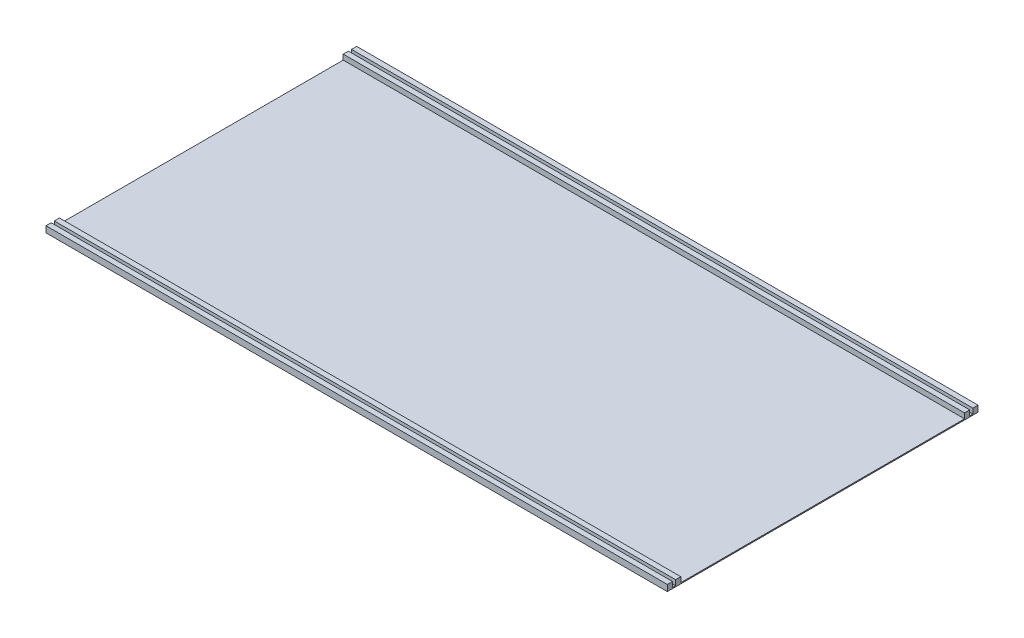
ISO-10303-21;
HEADER;
FILE_DESCRIPTION(('STEP AP214'),'2;1');
FILE_NAME('part.step','',(''),(''),'','','');
FILE_SCHEMA(('AUTOMOTIVE_DESIGN { 1 0 10303 214 1 1 1 1 }'));
ENDSEC;
DATA;
#1=APPLICATION_CONTEXT('core data for automotive mechanical design processes');
#2=APPLICATION_PROTOCOL_DEFINITION('international standard','automotive_design',2000,#1);
#3=PRODUCT_CONTEXT('',#1,'mechanical');
#4=PRODUCT('Part','Part','',(#3));
#5=PRODUCT_RELATED_PRODUCT_CATEGORY('part','',(#4));
#6=PRODUCT_DEFINITION_FORMATION('','',#4);
#7=PRODUCT_DEFINITION_CONTEXT('part definition',#1,'design');
#8=PRODUCT_DEFINITION('design','',#6,#7);
#9=PRODUCT_DEFINITION_SHAPE('','',#8);
#10=(LENGTH_UNIT() NAMED_UNIT(*) SI_UNIT(.MILLI.,.METRE.));
#11=(NAMED_UNIT(*) PLANE_ANGLE_UNIT() SI_UNIT($,.RADIAN.));
#12=(NAMED_UNIT(*) SI_UNIT($,.STERADIAN.) SOLID_ANGLE_UNIT());
#13=UNCERTAINTY_MEASURE_WITH_UNIT(LENGTH_MEASURE(1.E-05),#10,'distance_accuracy_value','');
#14=(GEOMETRIC_REPRESENTATION_CONTEXT(3) GLOBAL_UNCERTAINTY_ASSIGNED_CONTEXT((#13)) GLOBAL_UNIT_ASSIGNED_CONTEXT((#10,
#11,#12)) REPRESENTATION_CONTEXT('',''));
#15=CARTESIAN_POINT('',(0.,0.,0.));
#16=DIRECTION('',(0.,0.,1.));
#17=DIRECTION('',(1.,0.,0.));
#18=AXIS2_PLACEMENT_3D('',#15,#16,#17);
#19=CARTESIAN_POINT('',(0.,10.,0.));
#20=DIRECTION('',(0.,1.,0.));
#21=DIRECTION('',(0.,0.,1.));
#22=AXIS2_PLACEMENT_3D('',#19,#20,#21);
#23=PLANE('',#22);
#24=DIRECTION('',(0.,0.,-1.));
#25=VECTOR('',#24,1.);
#26=CARTESIAN_POINT('',(6000.,10.,0.));
#27=LINE('',#26,#25);
#28=CARTESIAN_POINT('',(6000.,10.,2870.));
#29=VERTEX_POINT('',#28);
#30=CARTESIAN_POINT('',(6000.,10.,130.));
#31=VERTEX_POINT('',#30);
#32=EDGE_CURVE('E283',#29,#31,#27,.T.);
#33=ORIENTED_EDGE('',*,*,#32,.T.);
#34=DIRECTION('',(1.,0.,0.));
#35=VECTOR('',#34,1.);
#36=CARTESIAN_POINT('',(0.,10.,130.));
#37=LINE('',#36,#35);
#38=CARTESIAN_POINT('',(0.,10.,130.));
#39=VERTEX_POINT('',#38);
#40=EDGE_CURVE('E55',#39,#31,#37,.T.);
#41=ORIENTED_EDGE('',*,*,#40,.F.);
#42=DIRECTION('',(0.,0.,1.));
#43=VECTOR('',#42,1.);
#44=CARTESIAN_POINT('',(0.,10.,0.));
#45=LINE('',#44,#43);
#46=CARTESIAN_POINT('',(0.,10.,2870.));
#47=VERTEX_POINT('',#46);
#48=EDGE_CURVE('E179',#39,#47,#45,.T.);
#49=ORIENTED_EDGE('',*,*,#48,.T.);
#50=DIRECTION('',(-1.,0.,0.));
#51=VECTOR('',#50,1.);
#52=CARTESIAN_POINT('',(0.,10.,2870.));
#53=LINE('',#52,#51);
#54=EDGE_CURVE('E220',#29,#47,#53,.T.);
#55=ORIENTED_EDGE('',*,*,#54,.F.);
#56=EDGE_LOOP('',(#33,#41,#49,#55));
#57=FACE_BOUND('',#56,.T.);
#58=ADVANCED_FACE('F39',(#57),#23,.T.);
#59=CARTESIAN_POINT('',(0.,10.,50.));
#60=VERTEX_POINT('',#59);
#61=CARTESIAN_POINT('',(0.,10.,80.));
#62=VERTEX_POINT('',#61);
#63=EDGE_CURVE('E63',#60,#62,#45,.T.);
#64=ORIENTED_EDGE('',*,*,#63,.T.);
#65=DIRECTION('',(-1.,0.,0.));
#66=VECTOR('',#65,1.);
#67=CARTESIAN_POINT('',(0.,10.,80.));
#68=LINE('',#67,#66);
#69=CARTESIAN_POINT('',(6000.,10.,80.));
#70=VERTEX_POINT('',#69);
#71=EDGE_CURVE('E175',#70,#62,#68,.T.);
#72=ORIENTED_EDGE('',*,*,#71,.F.);
#73=CARTESIAN_POINT('',(6000.,10.,50.));
#74=VERTEX_POINT('',#73);
#75=EDGE_CURVE('E276',#70,#74,#27,.T.);
#76=ORIENTED_EDGE('',*,*,#75,.T.);
#77=DIRECTION('',(1.,0.,0.));
#78=VECTOR('',#77,1.);
#79=CARTESIAN_POINT('',(0.,10.,50.));
#80=LINE('',#79,#78);
#81=EDGE_CURVE('E181',#60,#74,#80,.T.);
#82=ORIENTED_EDGE('',*,*,#81,.F.);
#83=EDGE_LOOP('',(#64,#72,#76,#82));
#84=FACE_BOUND('',#83,.T.);
#85=ADVANCED_FACE('F326',(#84),#23,.T.);
#86=CARTESIAN_POINT('',(6000.,10.,2950.));
#87=VERTEX_POINT('',#86);
#88=CARTESIAN_POINT('',(6000.,10.,2920.));
#89=VERTEX_POINT('',#88);
#90=EDGE_CURVE('E278',#87,#89,#27,.T.);
#91=ORIENTED_EDGE('',*,*,#90,.T.);
#92=DIRECTION('',(1.,0.,0.));
#93=VECTOR('',#92,1.);
#94=CARTESIAN_POINT('',(0.,10.,2920.));
#95=LINE('',#94,#93);
#96=CARTESIAN_POINT('',(0.,10.,2920.));
#97=VERTEX_POINT('',#96);
#98=EDGE_CURVE('E214',#97,#89,#95,.T.);
#99=ORIENTED_EDGE('',*,*,#98,.F.);
#100=CARTESIAN_POINT('',(0.,10.,2950.));
#101=VERTEX_POINT('',#100);
#102=EDGE_CURVE('E277',#97,#101,#45,.T.);
#103=ORIENTED_EDGE('',*,*,#102,.T.);
#104=DIRECTION('',(-1.,0.,0.));
#105=VECTOR('',#104,1.);
#106=CARTESIAN_POINT('',(0.,10.,2950.));
#107=LINE('',#106,#105);
#108=EDGE_CURVE('E247',#87,#101,#107,.T.);
#109=ORIENTED_EDGE('',*,*,#108,.F.);
#110=EDGE_LOOP('',(#91,#99,#103,#109));
#111=FACE_BOUND('',#110,.T.);
#112=ADVANCED_FACE('F352',(#111),#23,.T.);
#113=CARTESIAN_POINT('',(0.,10.,0.));
#114=DIRECTION('',(1.,0.,0.));
#115=DIRECTION('',(0.,0.,-1.));
#116=AXIS2_PLACEMENT_3D('',#113,#114,#115);
#117=PLANE('',#116);
#118=DIRECTION('',(0.,0.,1.));
#119=VECTOR('',#118,1.);
#120=CARTESIAN_POINT('',(0.,0.,0.));
#121=LINE('',#120,#119);
#122=CARTESIAN_POINT('',(0.,0.,0.));
#123=VERTEX_POINT('',#122);
#124=CARTESIAN_POINT('',(0.,0.,3000.));
#125=VERTEX_POINT('',#124);
#126=EDGE_CURVE('E273',#123,#125,#121,.T.);
#127=ORIENTED_EDGE('',*,*,#126,.T.);
#128=DIRECTION('',(0.,-1.,0.));
#129=VECTOR('',#128,1.);
#130=CARTESIAN_POINT('',(0.,10.,3000.));
#131=LINE('',#130,#129);
#132=CARTESIAN_POINT('',(0.,60.,3000.));
#133=VERTEX_POINT('',#132);
#134=EDGE_CURVE('E11',#133,#125,#131,.T.);
#135=ORIENTED_EDGE('',*,*,#134,.F.);
#136=DIRECTION('',(0.,0.,1.));
#137=VECTOR('',#136,1.);
#138=CARTESIAN_POINT('',(0.,60.,3000.));
#139=LINE('',#138,#137);
#140=CARTESIAN_POINT('',(0.,60.,2950.));
#141=VERTEX_POINT('',#140);
#142=EDGE_CURVE('E248',#141,#133,#139,.T.);
#143=ORIENTED_EDGE('',*,*,#142,.F.);
#144=DIRECTION('',(0.,-1.,0.));
#145=VECTOR('',#144,1.);
#146=CARTESIAN_POINT('',(0.,60.,2950.));
#147=LINE('',#146,#145);
#148=EDGE_CURVE('E262',#141,#101,#147,.T.);
#149=ORIENTED_EDGE('',*,*,#148,.T.);
#150=ORIENTED_EDGE('',*,*,#102,.F.);
#151=DIRECTION('',(0.,-1.,0.));
#152=VECTOR('',#151,1.);
#153=CARTESIAN_POINT('',(0.,60.,2920.));
#154=LINE('',#153,#152);
#155=CARTESIAN_POINT('',(0.,60.,2920.));
#156=VERTEX_POINT('',#155);
#157=EDGE_CURVE('E244',#156,#97,#154,.T.);
#158=ORIENTED_EDGE('',*,*,#157,.F.);
#159=DIRECTION('',(0.,0.,1.));
#160=VECTOR('',#159,1.);
#161=CARTESIAN_POINT('',(0.,60.,2920.));
#162=LINE('',#161,#160);
#163=CARTESIAN_POINT('',(0.,60.,2870.));
#164=VERTEX_POINT('',#163);
#165=EDGE_CURVE('E215',#164,#156,#162,.T.);
#166=ORIENTED_EDGE('',*,*,#165,.F.);
#167=DIRECTION('',(0.,-1.,0.));
#168=VECTOR('',#167,1.);
#169=CARTESIAN_POINT('',(0.,60.,2870.));
#170=LINE('',#169,#168);
#171=EDGE_CURVE('E229',#164,#47,#170,.T.);
#172=ORIENTED_EDGE('',*,*,#171,.T.);
#173=ORIENTED_EDGE('',*,*,#48,.F.);
#174=DIRECTION('',(0.,-1.,0.));
#175=VECTOR('',#174,1.);
#176=CARTESIAN_POINT('',(0.,60.,130.));
#177=LINE('',#176,#175);
#178=CARTESIAN_POINT('',(0.,60.,130.));
#179=VERTEX_POINT('',#178);
#180=EDGE_CURVE('E158',#179,#39,#177,.T.);
#181=ORIENTED_EDGE('',*,*,#180,.F.);
#182=DIRECTION('',(0.,0.,1.));
#183=VECTOR('',#182,1.);
#184=CARTESIAN_POINT('',(0.,60.,80.));
#185=LINE('',#184,#183);
#186=CARTESIAN_POINT('',(0.,60.,80.));
#187=VERTEX_POINT('',#186);
#188=EDGE_CURVE('E165',#187,#179,#185,.T.);
#189=ORIENTED_EDGE('',*,*,#188,.F.);
#190=DIRECTION('',(0.,-1.,0.));
#191=VECTOR('',#190,1.);
#192=CARTESIAN_POINT('',(0.,60.,80.));
#193=LINE('',#192,#191);
#194=EDGE_CURVE('E327',#187,#62,#193,.T.);
#195=ORIENTED_EDGE('',*,*,#194,.T.);
#196=ORIENTED_EDGE('',*,*,#63,.F.);
#197=DIRECTION('',(0.,-1.,0.));
#198=VECTOR('',#197,1.);
#199=CARTESIAN_POINT('',(0.,60.,50.));
#200=LINE('',#199,#198);
#201=CARTESIAN_POINT('',(0.,60.,50.));
#202=VERTEX_POINT('',#201);
#203=EDGE_CURVE('E210',#202,#60,#200,.T.);
#204=ORIENTED_EDGE('',*,*,#203,.F.);
#205=DIRECTION('',(0.,0.,1.));
#206=VECTOR('',#205,1.);
#207=CARTESIAN_POINT('',(0.,60.,0.));
#208=LINE('',#207,#206);
#209=CARTESIAN_POINT('',(0.,60.,0.));
#210=VERTEX_POINT('',#209);
#211=EDGE_CURVE('E186',#210,#202,#208,.T.);
#212=ORIENTED_EDGE('',*,*,#211,.F.);
#213=DIRECTION('',(0.,-1.,0.));
#214=VECTOR('',#213,1.);
#215=CARTESIAN_POINT('',(0.,10.,0.));
#216=LINE('',#215,#214);
#217=EDGE_CURVE('E282',#210,#123,#216,.T.);
#218=ORIENTED_EDGE('',*,*,#217,.T.);
#219=EDGE_LOOP('',(#127,#135,#143,#149,#150,#158,#166,#172,#173,#181,#189,#195,#196,#204,#212,#218));
#220=FACE_BOUND('',#219,.T.);
#221=ADVANCED_FACE('F41',(#220),#117,.F.);
#222=CARTESIAN_POINT('',(0.,10.,3000.));
#223=DIRECTION('',(0.,0.,-1.));
#224=DIRECTION('',(-1.,0.,0.));
#225=AXIS2_PLACEMENT_3D('',#222,#223,#224);
#226=PLANE('',#225);
#227=DIRECTION('',(1.,0.,0.));
#228=VECTOR('',#227,1.);
#229=CARTESIAN_POINT('',(0.,0.,3000.));
#230=LINE('',#229,#228);
#231=CARTESIAN_POINT('',(6000.,0.,3000.));
#232=VERTEX_POINT('',#231);
#233=EDGE_CURVE('E286',#125,#232,#230,.T.);
#234=ORIENTED_EDGE('',*,*,#233,.T.);
#235=DIRECTION('',(0.,-1.,0.));
#236=VECTOR('',#235,1.);
#237=CARTESIAN_POINT('',(6000.,10.,3000.));
#238=LINE('',#237,#236);
#239=CARTESIAN_POINT('',(6000.,60.,3000.));
#240=VERTEX_POINT('',#239);
#241=EDGE_CURVE('E48',#240,#232,#238,.T.);
#242=ORIENTED_EDGE('',*,*,#241,.F.);
#243=DIRECTION('',(1.,0.,0.));
#244=VECTOR('',#243,1.);
#245=CARTESIAN_POINT('',(0.,60.,3000.));
#246=LINE('',#245,#244);
#247=EDGE_CURVE('E252',#133,#240,#246,.T.);
#248=ORIENTED_EDGE('',*,*,#247,.F.);
#249=ORIENTED_EDGE('',*,*,#134,.T.);
#250=EDGE_LOOP('',(#234,#242,#248,#249));
#251=FACE_BOUND('',#250,.T.);
#252=ADVANCED_FACE('F363',(#251),#226,.F.);
#253=CARTESIAN_POINT('',(6000.,10.,0.));
#254=DIRECTION('',(-1.,0.,0.));
#255=DIRECTION('',(0.,0.,1.));
#256=AXIS2_PLACEMENT_3D('',#253,#254,#255);
#257=PLANE('',#256);
#258=DIRECTION('',(0.,0.,-1.));
#259=VECTOR('',#258,1.);
#260=CARTESIAN_POINT('',(6000.,0.,0.));
#261=LINE('',#260,#259);
#262=CARTESIAN_POINT('',(6000.,0.,0.));
#263=VERTEX_POINT('',#262);
#264=EDGE_CURVE('E289',#232,#263,#261,.T.);
#265=ORIENTED_EDGE('',*,*,#264,.T.);
#266=DIRECTION('',(0.,-1.,0.));
#267=VECTOR('',#266,1.);
#268=CARTESIAN_POINT('',(6000.,10.,0.));
#269=LINE('',#268,#267);
#270=CARTESIAN_POINT('',(6000.,60.,0.));
#271=VERTEX_POINT('',#270);
#272=EDGE_CURVE('E298',#271,#263,#269,.T.);
#273=ORIENTED_EDGE('',*,*,#272,.F.);
#274=DIRECTION('',(0.,0.,-1.));
#275=VECTOR('',#274,1.);
#276=CARTESIAN_POINT('',(6000.,60.,0.));
#277=LINE('',#276,#275);
#278=CARTESIAN_POINT('',(6000.,60.,49.9999999999998));
#279=VERTEX_POINT('',#278);
#280=EDGE_CURVE('E198',#279,#271,#277,.T.);
#281=ORIENTED_EDGE('',*,*,#280,.F.);
#282=DIRECTION('',(0.,-1.,0.));
#283=VECTOR('',#282,1.);
#284=CARTESIAN_POINT('',(6000.,60.,49.9999999999998));
#285=LINE('',#284,#283);
#286=EDGE_CURVE('E205',#279,#74,#285,.T.);
#287=ORIENTED_EDGE('',*,*,#286,.T.);
#288=ORIENTED_EDGE('',*,*,#75,.F.);
#289=DIRECTION('',(0.,-1.,0.));
#290=VECTOR('',#289,1.);
#291=CARTESIAN_POINT('',(6000.,60.,80.));
#292=LINE('',#291,#290);
#293=CARTESIAN_POINT('',(6000.,60.,80.));
#294=VERTEX_POINT('',#293);
#295=EDGE_CURVE('E188',#294,#70,#292,.T.);
#296=ORIENTED_EDGE('',*,*,#295,.F.);
#297=DIRECTION('',(0.,0.,-1.));
#298=VECTOR('',#297,1.);
#299=CARTESIAN_POINT('',(6000.,60.,80.));
#300=LINE('',#299,#298);
#301=CARTESIAN_POINT('',(6000.,60.,130.));
#302=VERTEX_POINT('',#301);
#303=EDGE_CURVE('E164',#302,#294,#300,.T.);
#304=ORIENTED_EDGE('',*,*,#303,.F.);
#305=DIRECTION('',(0.,-1.,0.));
#306=VECTOR('',#305,1.);
#307=CARTESIAN_POINT('',(6000.,60.,130.));
#308=LINE('',#307,#306);
#309=EDGE_CURVE('E160',#302,#31,#308,.T.);
#310=ORIENTED_EDGE('',*,*,#309,.T.);
#311=ORIENTED_EDGE('',*,*,#32,.F.);
#312=DIRECTION('',(0.,-1.,0.));
#313=VECTOR('',#312,1.);
#314=CARTESIAN_POINT('',(6000.,60.,2870.));
#315=LINE('',#314,#313);
#316=CARTESIAN_POINT('',(6000.,60.,2870.));
#317=VERTEX_POINT('',#316);
#318=EDGE_CURVE('E237',#317,#29,#315,.T.);
#319=ORIENTED_EDGE('',*,*,#318,.F.);
#320=DIRECTION('',(0.,0.,-1.));
#321=VECTOR('',#320,1.);
#322=CARTESIAN_POINT('',(6000.,60.,2920.));
#323=LINE('',#322,#321);
#324=CARTESIAN_POINT('',(6000.,60.,2920.));
#325=VERTEX_POINT('',#324);
#326=EDGE_CURVE('E223',#325,#317,#323,.T.);
#327=ORIENTED_EDGE('',*,*,#326,.F.);
#328=DIRECTION('',(0.,-1.,0.));
#329=VECTOR('',#328,1.);
#330=CARTESIAN_POINT('',(6000.,60.,2920.));
#331=LINE('',#330,#329);
#332=EDGE_CURVE('E240',#325,#89,#331,.T.);
#333=ORIENTED_EDGE('',*,*,#332,.T.);
#334=ORIENTED_EDGE('',*,*,#90,.F.);
#335=DIRECTION('',(0.,-1.,0.));
#336=VECTOR('',#335,1.);
#337=CARTESIAN_POINT('',(6000.,60.,2950.));
#338=LINE('',#337,#336);
#339=CARTESIAN_POINT('',(6000.,60.,2950.));
#340=VERTEX_POINT('',#339);
#341=EDGE_CURVE('E269',#340,#87,#338,.T.);
#342=ORIENTED_EDGE('',*,*,#341,.F.);
#343=DIRECTION('',(0.,0.,-1.));
#344=VECTOR('',#343,1.);
#345=CARTESIAN_POINT('',(6000.,60.,3000.));
#346=LINE('',#345,#344);
#347=EDGE_CURVE('E256',#240,#340,#346,.T.);
#348=ORIENTED_EDGE('',*,*,#347,.F.);
#349=ORIENTED_EDGE('',*,*,#241,.T.);
#350=EDGE_LOOP('',(#265,#273,#281,#287,#288,#296,#304,#310,#311,#319,#327,#333,#334,#342,#348,#349));
#351=FACE_BOUND('',#350,.T.);
#352=ADVANCED_FACE('F306',(#351),#257,.F.);
#353=CARTESIAN_POINT('',(0.,10.,0.));
#354=DIRECTION('',(0.,0.,1.));
#355=DIRECTION('',(1.,0.,0.));
#356=AXIS2_PLACEMENT_3D('',#353,#354,#355);
#357=PLANE('',#356);
#358=DIRECTION('',(-1.,0.,0.));
#359=VECTOR('',#358,1.);
#360=CARTESIAN_POINT('',(0.,0.,0.));
#361=LINE('',#360,#359);
#362=EDGE_CURVE('E292',#263,#123,#361,.T.);
#363=ORIENTED_EDGE('',*,*,#362,.T.);
#364=ORIENTED_EDGE('',*,*,#217,.F.);
#365=DIRECTION('',(-1.,0.,0.));
#366=VECTOR('',#365,1.);
#367=CARTESIAN_POINT('',(0.,60.,0.));
#368=LINE('',#367,#366);
#369=EDGE_CURVE('E202',#271,#210,#368,.T.);
#370=ORIENTED_EDGE('',*,*,#369,.F.);
#371=ORIENTED_EDGE('',*,*,#272,.T.);
#372=EDGE_LOOP('',(#363,#364,#370,#371));
#373=FACE_BOUND('',#372,.T.);
#374=ADVANCED_FACE('F315',(#373),#357,.F.);
#375=CARTESIAN_POINT('',(0.,0.,0.));
#376=DIRECTION('',(0.,1.,0.));
#377=DIRECTION('',(0.,0.,1.));
#378=AXIS2_PLACEMENT_3D('',#375,#376,#377);
#379=PLANE('',#378);
#380=ORIENTED_EDGE('',*,*,#126,.F.);
#381=ORIENTED_EDGE('',*,*,#362,.F.);
#382=ORIENTED_EDGE('',*,*,#264,.F.);
#383=ORIENTED_EDGE('',*,*,#233,.F.);
#384=EDGE_LOOP('',(#380,#381,#382,#383));
#385=FACE_BOUND('',#384,.T.);
#386=ADVANCED_FACE('F313',(#385),#379,.F.);
#387=CARTESIAN_POINT('',(0.,60.,2950.));
#388=DIRECTION('',(0.,0.,1.));
#389=DIRECTION('',(1.,0.,0.));
#390=AXIS2_PLACEMENT_3D('',#387,#388,#389);
#391=PLANE('',#390);
#392=ORIENTED_EDGE('',*,*,#108,.T.);
#393=ORIENTED_EDGE('',*,*,#148,.F.);
#394=DIRECTION('',(-1.,0.,0.));
#395=VECTOR('',#394,1.);
#396=CARTESIAN_POINT('',(0.,60.,2950.));
#397=LINE('',#396,#395);
#398=EDGE_CURVE('E259',#340,#141,#397,.T.);
#399=ORIENTED_EDGE('',*,*,#398,.F.);
#400=ORIENTED_EDGE('',*,*,#341,.T.);
#401=EDGE_LOOP('',(#392,#393,#399,#400));
#402=FACE_BOUND('',#401,.T.);
#403=ADVANCED_FACE('F371',(#402),#391,.F.);
#404=CARTESIAN_POINT('',(0.,60.,0.));
#405=DIRECTION('',(0.,-1.,0.));
#406=DIRECTION('',(0.,0.,-1.));
#407=AXIS2_PLACEMENT_3D('',#404,#405,#406);
#408=PLANE('',#407);
#409=ORIENTED_EDGE('',*,*,#142,.T.);
#410=ORIENTED_EDGE('',*,*,#247,.T.);
#411=ORIENTED_EDGE('',*,*,#347,.T.);
#412=ORIENTED_EDGE('',*,*,#398,.T.);
#413=EDGE_LOOP('',(#409,#410,#411,#412));
#414=FACE_BOUND('',#413,.T.);
#415=ADVANCED_FACE('F375',(#414),#408,.F.);
#416=CARTESIAN_POINT('',(0.,60.,2920.));
#417=DIRECTION('',(0.,0.,-1.));
#418=DIRECTION('',(-1.,0.,0.));
#419=AXIS2_PLACEMENT_3D('',#416,#417,#418);
#420=PLANE('',#419);
#421=ORIENTED_EDGE('',*,*,#98,.T.);
#422=ORIENTED_EDGE('',*,*,#332,.F.);
#423=DIRECTION('',(1.,0.,0.));
#424=VECTOR('',#423,1.);
#425=CARTESIAN_POINT('',(0.,60.,2920.));
#426=LINE('',#425,#424);
#427=EDGE_CURVE('E219',#156,#325,#426,.T.);
#428=ORIENTED_EDGE('',*,*,#427,.F.);
#429=ORIENTED_EDGE('',*,*,#157,.T.);
#430=EDGE_LOOP('',(#421,#422,#428,#429));
#431=FACE_BOUND('',#430,.T.);
#432=ADVANCED_FACE('F392',(#431),#420,.F.);
#433=CARTESIAN_POINT('',(0.,60.,2870.));
#434=DIRECTION('',(0.,0.,1.));
#435=DIRECTION('',(1.,0.,0.));
#436=AXIS2_PLACEMENT_3D('',#433,#434,#435);
#437=PLANE('',#436);
#438=ORIENTED_EDGE('',*,*,#54,.T.);
#439=ORIENTED_EDGE('',*,*,#171,.F.);
#440=DIRECTION('',(-1.,0.,0.));
#441=VECTOR('',#440,1.);
#442=CARTESIAN_POINT('',(0.,60.,2870.));
#443=LINE('',#442,#441);
#444=EDGE_CURVE('E226',#317,#164,#443,.T.);
#445=ORIENTED_EDGE('',*,*,#444,.F.);
#446=ORIENTED_EDGE('',*,*,#318,.T.);
#447=EDGE_LOOP('',(#438,#439,#445,#446));
#448=FACE_BOUND('',#447,.T.);
#449=ADVANCED_FACE('F384',(#448),#437,.F.);
#450=CARTESIAN_POINT('',(0.,60.,0.));
#451=DIRECTION('',(0.,-1.,0.));
#452=DIRECTION('',(0.,0.,-1.));
#453=AXIS2_PLACEMENT_3D('',#450,#451,#452);
#454=PLANE('',#453);
#455=ORIENTED_EDGE('',*,*,#165,.T.);
#456=ORIENTED_EDGE('',*,*,#427,.T.);
#457=ORIENTED_EDGE('',*,*,#326,.T.);
#458=ORIENTED_EDGE('',*,*,#444,.T.);
#459=EDGE_LOOP('',(#455,#456,#457,#458));
#460=FACE_BOUND('',#459,.T.);
#461=ADVANCED_FACE('F388',(#460),#454,.F.);
#462=CARTESIAN_POINT('',(0.,60.,50.));
#463=DIRECTION('',(0.,0.,-1.));
#464=DIRECTION('',(-1.,0.,0.));
#465=AXIS2_PLACEMENT_3D('',#462,#463,#464);
#466=PLANE('',#465);
#467=ORIENTED_EDGE('',*,*,#81,.T.);
#468=ORIENTED_EDGE('',*,*,#286,.F.);
#469=DIRECTION('',(1.,0.,0.));
#470=VECTOR('',#469,1.);
#471=CARTESIAN_POINT('',(0.,60.,50.));
#472=LINE('',#471,#470);
#473=EDGE_CURVE('E195',#202,#279,#472,.T.);
#474=ORIENTED_EDGE('',*,*,#473,.F.);
#475=ORIENTED_EDGE('',*,*,#203,.T.);
#476=EDGE_LOOP('',(#467,#468,#474,#475));
#477=FACE_BOUND('',#476,.T.);
#478=ADVANCED_FACE('F325',(#477),#466,.F.);
#479=CARTESIAN_POINT('',(0.,60.,0.));
#480=DIRECTION('',(0.,1.,0.));
#481=DIRECTION('',(0.,0.,1.));
#482=AXIS2_PLACEMENT_3D('',#479,#480,#481);
#483=PLANE('',#482);
#484=ORIENTED_EDGE('',*,*,#211,.T.);
#485=ORIENTED_EDGE('',*,*,#473,.T.);
#486=ORIENTED_EDGE('',*,*,#280,.T.);
#487=ORIENTED_EDGE('',*,*,#369,.T.);
#488=EDGE_LOOP('',(#484,#485,#486,#487));
#489=FACE_BOUND('',#488,.T.);
#490=ADVANCED_FACE('F320',(#489),#483,.T.);
#491=CARTESIAN_POINT('',(0.,60.,130.));
#492=DIRECTION('',(0.,0.,-1.));
#493=DIRECTION('',(-1.,0.,0.));
#494=AXIS2_PLACEMENT_3D('',#491,#492,#493);
#495=PLANE('',#494);
#496=ORIENTED_EDGE('',*,*,#40,.T.);
#497=ORIENTED_EDGE('',*,*,#309,.F.);
#498=DIRECTION('',(1.,0.,0.));
#499=VECTOR('',#498,1.);
#500=CARTESIAN_POINT('',(0.,60.,130.));
#501=LINE('',#500,#499);
#502=EDGE_CURVE('E154',#179,#302,#501,.T.);
#503=ORIENTED_EDGE('',*,*,#502,.F.);
#504=ORIENTED_EDGE('',*,*,#180,.T.);
#505=EDGE_LOOP('',(#496,#497,#503,#504));
#506=FACE_BOUND('',#505,.T.);
#507=ADVANCED_FACE('F156',(#506),#495,.F.);
#508=CARTESIAN_POINT('',(0.,60.,80.));
#509=DIRECTION('',(0.,0.,1.));
#510=DIRECTION('',(1.,0.,0.));
#511=AXIS2_PLACEMENT_3D('',#508,#509,#510);
#512=PLANE('',#511);
#513=ORIENTED_EDGE('',*,*,#71,.T.);
#514=ORIENTED_EDGE('',*,*,#194,.F.);
#515=DIRECTION('',(-1.,0.,0.));
#516=VECTOR('',#515,1.);
#517=CARTESIAN_POINT('',(0.,60.,80.));
#518=LINE('',#517,#516);
#519=EDGE_CURVE('E170',#294,#187,#518,.T.);
#520=ORIENTED_EDGE('',*,*,#519,.F.);
#521=ORIENTED_EDGE('',*,*,#295,.T.);
#522=EDGE_LOOP('',(#513,#514,#520,#521));
#523=FACE_BOUND('',#522,.T.);
#524=ADVANCED_FACE('F341',(#523),#512,.F.);
#525=CARTESIAN_POINT('',(0.,60.,0.));
#526=DIRECTION('',(0.,1.,0.));
#527=DIRECTION('',(0.,0.,1.));
#528=AXIS2_PLACEMENT_3D('',#525,#526,#527);
#529=PLANE('',#528);
#530=ORIENTED_EDGE('',*,*,#188,.T.);
#531=ORIENTED_EDGE('',*,*,#502,.T.);
#532=ORIENTED_EDGE('',*,*,#303,.T.);
#533=ORIENTED_EDGE('',*,*,#519,.T.);
#534=EDGE_LOOP('',(#530,#531,#532,#533));
#535=FACE_BOUND('',#534,.T.);
#536=ADVANCED_FACE('F168',(#535),#529,.T.);
#537=CLOSED_SHELL('',(#58,#85,#112,#221,#252,#352,#374,#386,#403,#415,#432,#449,#461,#478,#490,
#507,#524,#536));
#538=MANIFOLD_SOLID_BREP('B2',#537);
#539=ADVANCED_BREP_SHAPE_REPRESENTATION('',(#18,#538),#14);
#540=SHAPE_DEFINITION_REPRESENTATION(#9,#539);
ENDSEC;
END-ISO-10303-21;
